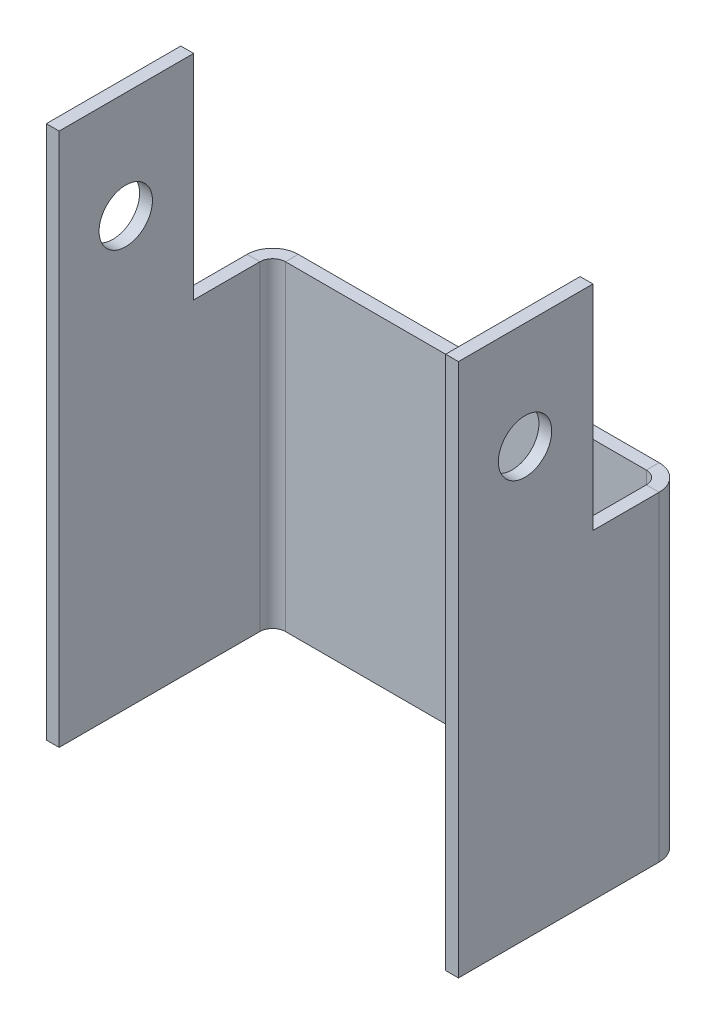
ISO-10303-21;
HEADER;
FILE_DESCRIPTION(('STEP AP214'),'2;1');
FILE_NAME('part.step','',(''),(''),'','','');
FILE_SCHEMA(('AUTOMOTIVE_DESIGN { 1 0 10303 214 1 1 1 1 }'));
ENDSEC;
DATA;
#1=APPLICATION_CONTEXT('core data for automotive mechanical design processes');
#2=APPLICATION_PROTOCOL_DEFINITION('international standard','automotive_design',2000,#1);
#3=PRODUCT_CONTEXT('',#1,'mechanical');
#4=PRODUCT('Part','Part','',(#3));
#5=PRODUCT_RELATED_PRODUCT_CATEGORY('part','',(#4));
#6=PRODUCT_DEFINITION_FORMATION('','',#4);
#7=PRODUCT_DEFINITION_CONTEXT('part definition',#1,'design');
#8=PRODUCT_DEFINITION('design','',#6,#7);
#9=PRODUCT_DEFINITION_SHAPE('','',#8);
#10=(LENGTH_UNIT() NAMED_UNIT(*) SI_UNIT(.MILLI.,.METRE.));
#11=(NAMED_UNIT(*) PLANE_ANGLE_UNIT() SI_UNIT($,.RADIAN.));
#12=(NAMED_UNIT(*) SI_UNIT($,.STERADIAN.) SOLID_ANGLE_UNIT());
#13=UNCERTAINTY_MEASURE_WITH_UNIT(LENGTH_MEASURE(1.E-05),#10,'distance_accuracy_value','');
#14=(GEOMETRIC_REPRESENTATION_CONTEXT(3) GLOBAL_UNCERTAINTY_ASSIGNED_CONTEXT((#13)) GLOBAL_UNIT_ASSIGNED_CONTEXT((#10,
#11,#12)) REPRESENTATION_CONTEXT('',''));
#15=CARTESIAN_POINT('',(0.,0.,0.));
#16=DIRECTION('',(0.,0.,1.));
#17=DIRECTION('',(1.,0.,0.));
#18=AXIS2_PLACEMENT_3D('',#15,#16,#17);
#19=CARTESIAN_POINT('',(-49.149,6.35000000000006,-1.52399999999975));
#20=DIRECTION('',(0.,-1.,0.));
#21=DIRECTION('',(1.,0.,0.));
#22=AXIS2_PLACEMENT_3D('',#19,#20,#21);
#23=PLANE('',#22);
#24=DIRECTION('',(0.,0.,-1.));
#25=VECTOR('',#24,1.);
#26=CARTESIAN_POINT('',(-22.987,6.35000000000006,0.));
#27=LINE('',#26,#25);
#28=CARTESIAN_POINT('',(-22.987,6.35000000000006,9.39800000000015));
#29=VERTEX_POINT('',#28);
#30=CARTESIAN_POINT('',(-22.987,6.35000000000006,1.52399999999999));
#31=VERTEX_POINT('',#30);
#32=EDGE_CURVE('E303',#29,#31,#27,.T.);
#33=ORIENTED_EDGE('',*,*,#32,.T.);
#34=DIRECTION('',(-1.,0.,0.));
#35=VECTOR('',#34,1.);
#36=CARTESIAN_POINT('',(-22.987,6.35000000000006,1.52399999999999));
#37=LINE('',#36,#35);
#38=CARTESIAN_POINT('',(-24.511,6.35000000000006,1.52399999999999));
#39=VERTEX_POINT('',#38);
#40=EDGE_CURVE('E13',#31,#39,#37,.T.);
#41=ORIENTED_EDGE('',*,*,#40,.T.);
#42=DIRECTION('',(0.,0.,-1.));
#43=VECTOR('',#42,1.);
#44=CARTESIAN_POINT('',(-24.511,6.35000000000006,0.));
#45=LINE('',#44,#43);
#46=CARTESIAN_POINT('',(-24.511,6.35000000000006,9.39800000000016));
#47=VERTEX_POINT('',#46);
#48=EDGE_CURVE('E436',#47,#39,#45,.T.);
#49=ORIENTED_EDGE('',*,*,#48,.F.);
#50=DIRECTION('',(1.,0.,0.));
#51=VECTOR('',#50,1.);
#52=CARTESIAN_POINT('',(-49.149,6.35000000000006,9.39800000000025));
#53=LINE('',#52,#51);
#54=EDGE_CURVE('E464',#47,#29,#53,.T.);
#55=ORIENTED_EDGE('',*,*,#54,.T.);
#56=EDGE_LOOP('',(#33,#41,#49,#55));
#57=FACE_BOUND('',#56,.T.);
#58=ADVANCED_FACE('F89',(#57),#23,.F.);
#59=DIRECTION('',(1.,0.,0.));
#60=VECTOR('',#59,1.);
#61=CARTESIAN_POINT('',(-49.149,6.35000000000006,-1.52399999999975));
#62=LINE('',#61,#60);
#63=CARTESIAN_POINT('',(-21.463,6.35000000000006,-1.52399999999985));
#64=VERTEX_POINT('',#63);
#65=CARTESIAN_POINT('',(21.463,6.35000000000006,-1.524));
#66=VERTEX_POINT('',#65);
#67=EDGE_CURVE('E300',#64,#66,#62,.T.);
#68=ORIENTED_EDGE('',*,*,#67,.F.);
#69=DIRECTION('',(0.,0.,1.));
#70=VECTOR('',#69,1.);
#71=CARTESIAN_POINT('',(-21.463,6.35000000000006,-1.52399999999985));
#72=LINE('',#71,#70);
#73=CARTESIAN_POINT('',(-21.463,6.35000000000006,0.));
#74=VERTEX_POINT('',#73);
#75=EDGE_CURVE('E98',#64,#74,#72,.T.);
#76=ORIENTED_EDGE('',*,*,#75,.T.);
#77=DIRECTION('',(1.,0.,0.));
#78=VECTOR('',#77,1.);
#79=CARTESIAN_POINT('',(0.,6.35000000000006,0.));
#80=LINE('',#79,#78);
#81=CARTESIAN_POINT('',(21.463,6.35000000000007,0.));
#82=VERTEX_POINT('',#81);
#83=EDGE_CURVE('E320',#74,#82,#80,.T.);
#84=ORIENTED_EDGE('',*,*,#83,.T.);
#85=DIRECTION('',(0.,0.,-1.));
#86=VECTOR('',#85,1.);
#87=CARTESIAN_POINT('',(21.463,6.35000000000007,0.));
#88=LINE('',#87,#86);
#89=EDGE_CURVE('E310',#82,#66,#88,.T.);
#90=ORIENTED_EDGE('',*,*,#89,.T.);
#91=EDGE_LOOP('',(#68,#76,#84,#90));
#92=FACE_BOUND('',#91,.T.);
#93=ADVANCED_FACE('F318',(#92),#23,.F.);
#94=ORIENTED_EDGE('',*,*,#40,.F.);
#95=CARTESIAN_POINT('',(-21.463,6.35000000000006,1.524));
#96=DIRECTION('',(0.,-1.,0.));
#97=DIRECTION('',(1.,0.,0.));
#98=AXIS2_PLACEMENT_3D('',#95,#96,#97);
#99=CIRCLE('',#98,1.524);
#100=EDGE_CURVE('E326',#74,#31,#99,.F.);
#101=ORIENTED_EDGE('',*,*,#100,.F.);
#102=ORIENTED_EDGE('',*,*,#75,.F.);
#103=CARTESIAN_POINT('',(-21.463,6.35000000000006,1.524));
#104=DIRECTION('',(0.,-1.,0.));
#105=DIRECTION('',(1.,0.,0.));
#106=AXIS2_PLACEMENT_3D('',#103,#104,#105);
#107=CIRCLE('',#106,3.048);
#108=EDGE_CURVE('E433',#64,#39,#107,.F.);
#109=ORIENTED_EDGE('',*,*,#108,.T.);
#110=EDGE_LOOP('',(#94,#101,#102,#109));
#111=FACE_BOUND('',#110,.T.);
#112=ADVANCED_FACE('F327',(#111),#23,.F.);
#113=DIRECTION('',(0.,0.,-1.));
#114=VECTOR('',#113,1.);
#115=CARTESIAN_POINT('',(24.511,6.35000000000007,-1.52400000000001));
#116=LINE('',#115,#114);
#117=CARTESIAN_POINT('',(24.511,6.35000000000007,9.39799999999999));
#118=VERTEX_POINT('',#117);
#119=CARTESIAN_POINT('',(24.511,6.35000000000007,1.52399999999999));
#120=VERTEX_POINT('',#119);
#121=EDGE_CURVE('E216',#118,#120,#116,.T.);
#122=ORIENTED_EDGE('',*,*,#121,.T.);
#123=DIRECTION('',(-1.,0.,0.));
#124=VECTOR('',#123,1.);
#125=CARTESIAN_POINT('',(24.511,6.35000000000007,1.52399999999999));
#126=LINE('',#125,#124);
#127=CARTESIAN_POINT('',(22.987,6.35000000000006,1.524));
#128=VERTEX_POINT('',#127);
#129=EDGE_CURVE('E307',#120,#128,#126,.T.);
#130=ORIENTED_EDGE('',*,*,#129,.T.);
#131=DIRECTION('',(0.,0.,-1.));
#132=VECTOR('',#131,1.);
#133=CARTESIAN_POINT('',(22.987,6.35000000000007,0.));
#134=LINE('',#133,#132);
#135=CARTESIAN_POINT('',(22.987,6.35000000000007,9.39799999999999));
#136=VERTEX_POINT('',#135);
#137=EDGE_CURVE('E440',#136,#128,#134,.T.);
#138=ORIENTED_EDGE('',*,*,#137,.F.);
#139=EDGE_CURVE('E461',#136,#118,#53,.T.);
#140=ORIENTED_EDGE('',*,*,#139,.T.);
#141=EDGE_LOOP('',(#122,#130,#138,#140));
#142=FACE_BOUND('',#141,.T.);
#143=ADVANCED_FACE('F470',(#142),#23,.F.);
#144=CARTESIAN_POINT('',(0.,0.,-1.524));
#145=DIRECTION('',(0.,0.,1.));
#146=DIRECTION('',(1.,0.,0.));
#147=AXIS2_PLACEMENT_3D('',#144,#145,#146);
#148=PLANE('',#147);
#149=DIRECTION('',(0.,-1.,0.));
#150=VECTOR('',#149,1.);
#151=CARTESIAN_POINT('',(-21.463,-31.75,-1.524));
#152=LINE('',#151,#150);
#153=CARTESIAN_POINT('',(-21.463,-31.75,-1.524));
#154=VERTEX_POINT('',#153);
#155=EDGE_CURVE('E352',#154,#64,#152,.F.);
#156=ORIENTED_EDGE('',*,*,#155,.T.);
#157=ORIENTED_EDGE('',*,*,#67,.T.);
#158=DIRECTION('',(0.,1.,0.));
#159=VECTOR('',#158,1.);
#160=CARTESIAN_POINT('',(21.463,31.75,-1.524));
#161=LINE('',#160,#159);
#162=CARTESIAN_POINT('',(21.463,-31.75,-1.524));
#163=VERTEX_POINT('',#162);
#164=EDGE_CURVE('E113',#66,#163,#161,.F.);
#165=ORIENTED_EDGE('',*,*,#164,.T.);
#166=DIRECTION('',(1.,0.,0.));
#167=VECTOR('',#166,1.);
#168=CARTESIAN_POINT('',(-24.511,-31.75,-1.524));
#169=LINE('',#168,#167);
#170=EDGE_CURVE('E288',#154,#163,#169,.T.);
#171=ORIENTED_EDGE('',*,*,#170,.F.);
#172=EDGE_LOOP('',(#156,#157,#165,#171));
#173=FACE_BOUND('',#172,.T.);
#174=ADVANCED_FACE('F387',(#173),#148,.F.);
#175=CARTESIAN_POINT('',(0.,0.,0.));
#176=DIRECTION('',(0.,0.,1.));
#177=DIRECTION('',(1.,0.,0.));
#178=AXIS2_PLACEMENT_3D('',#175,#176,#177);
#179=PLANE('',#178);
#180=ORIENTED_EDGE('',*,*,#83,.F.);
#181=DIRECTION('',(0.,-1.,0.));
#182=VECTOR('',#181,1.);
#183=CARTESIAN_POINT('',(-21.463,-31.75,0.));
#184=LINE('',#183,#182);
#185=CARTESIAN_POINT('',(-21.463,-31.75,0.));
#186=VERTEX_POINT('',#185);
#187=EDGE_CURVE('E336',#186,#74,#184,.F.);
#188=ORIENTED_EDGE('',*,*,#187,.F.);
#189=DIRECTION('',(1.,0.,0.));
#190=VECTOR('',#189,1.);
#191=CARTESIAN_POINT('',(-24.511,-31.75,0.));
#192=LINE('',#191,#190);
#193=CARTESIAN_POINT('',(21.463,-31.75,0.));
#194=VERTEX_POINT('',#193);
#195=EDGE_CURVE('E287',#186,#194,#192,.T.);
#196=ORIENTED_EDGE('',*,*,#195,.T.);
#197=DIRECTION('',(0.,1.,0.));
#198=VECTOR('',#197,1.);
#199=CARTESIAN_POINT('',(21.463,31.75,0.));
#200=LINE('',#199,#198);
#201=EDGE_CURVE('E281',#82,#194,#200,.F.);
#202=ORIENTED_EDGE('',*,*,#201,.F.);
#203=EDGE_LOOP('',(#180,#188,#196,#202));
#204=FACE_BOUND('',#203,.T.);
#205=ADVANCED_FACE('F335',(#204),#179,.T.);
#206=CARTESIAN_POINT('',(-24.511,-31.75,-1.524));
#207=DIRECTION('',(0.,-1.,0.));
#208=DIRECTION('',(0.,0.,-1.));
#209=AXIS2_PLACEMENT_3D('',#206,#207,#208);
#210=PLANE('',#209);
#211=ORIENTED_EDGE('',*,*,#195,.F.);
#212=DIRECTION('',(0.,0.,-1.));
#213=VECTOR('',#212,1.);
#214=CARTESIAN_POINT('',(-21.463,-31.75,0.));
#215=LINE('',#214,#213);
#216=EDGE_CURVE('E269',#186,#154,#215,.T.);
#217=ORIENTED_EDGE('',*,*,#216,.T.);
#218=ORIENTED_EDGE('',*,*,#170,.T.);
#219=DIRECTION('',(0.,0.,-1.));
#220=VECTOR('',#219,1.);
#221=CARTESIAN_POINT('',(21.463,-31.75,0.));
#222=LINE('',#221,#220);
#223=EDGE_CURVE('E277',#194,#163,#222,.T.);
#224=ORIENTED_EDGE('',*,*,#223,.F.);
#225=EDGE_LOOP('',(#211,#217,#218,#224));
#226=FACE_BOUND('',#225,.T.);
#227=ADVANCED_FACE('F91',(#226),#210,.T.);
#228=CARTESIAN_POINT('',(21.463,-31.75,1.524));
#229=DIRECTION('',(0.,-1.,0.));
#230=DIRECTION('',(0.,0.,-1.));
#231=AXIS2_PLACEMENT_3D('',#228,#229,#230);
#232=PLANE('',#231);
#233=DIRECTION('',(1.,0.,0.));
#234=VECTOR('',#233,1.);
#235=CARTESIAN_POINT('',(24.511,-31.75,1.52399999999999));
#236=LINE('',#235,#234);
#237=CARTESIAN_POINT('',(22.987,-31.75,1.524));
#238=VERTEX_POINT('',#237);
#239=CARTESIAN_POINT('',(24.511,-31.7499999999999,1.52399999999999));
#240=VERTEX_POINT('',#239);
#241=EDGE_CURVE('E265',#238,#240,#236,.T.);
#242=ORIENTED_EDGE('',*,*,#241,.F.);
#243=CARTESIAN_POINT('',(21.463,-31.75,1.524));
#244=DIRECTION('',(0.,1.,0.));
#245=DIRECTION('',(0.,0.,1.));
#246=AXIS2_PLACEMENT_3D('',#243,#244,#245);
#247=CIRCLE('',#246,1.524);
#248=EDGE_CURVE('E273',#194,#238,#247,.F.);
#249=ORIENTED_EDGE('',*,*,#248,.F.);
#250=ORIENTED_EDGE('',*,*,#223,.T.);
#251=CARTESIAN_POINT('',(21.463,-31.7499999999999,1.524));
#252=DIRECTION('',(0.,1.,0.));
#253=DIRECTION('',(0.,0.,1.));
#254=AXIS2_PLACEMENT_3D('',#251,#252,#253);
#255=CIRCLE('',#254,3.048);
#256=EDGE_CURVE('E272',#163,#240,#255,.F.);
#257=ORIENTED_EDGE('',*,*,#256,.T.);
#258=EDGE_LOOP('',(#242,#249,#250,#257));
#259=FACE_BOUND('',#258,.T.);
#260=ADVANCED_FACE('F380',(#259),#232,.T.);
#261=CARTESIAN_POINT('',(21.463,31.75,1.52400000000001));
#262=DIRECTION('',(0.,1.,0.));
#263=DIRECTION('',(1.,0.,0.));
#264=AXIS2_PLACEMENT_3D('',#261,#262,#263);
#265=CYLINDRICAL_SURFACE('',#264,3.048);
#266=CARTESIAN_POINT('',(21.463,6.35000000000006,1.524));
#267=DIRECTION('',(0.,-1.,0.));
#268=DIRECTION('',(1.,0.,0.));
#269=AXIS2_PLACEMENT_3D('',#266,#267,#268);
#270=CIRCLE('',#269,3.048);
#271=EDGE_CURVE('E378',#120,#66,#270,.F.);
#272=ORIENTED_EDGE('',*,*,#271,.F.);
#273=DIRECTION('',(0.,1.,0.));
#274=VECTOR('',#273,1.);
#275=CARTESIAN_POINT('',(24.511,0.,1.52399999999999));
#276=LINE('',#275,#274);
#277=EDGE_CURVE('E258',#240,#120,#276,.T.);
#278=ORIENTED_EDGE('',*,*,#277,.F.);
#279=ORIENTED_EDGE('',*,*,#256,.F.);
#280=ORIENTED_EDGE('',*,*,#164,.F.);
#281=EDGE_LOOP('',(#272,#278,#279,#280));
#282=FACE_BOUND('',#281,.T.);
#283=ADVANCED_FACE('F376',(#282),#265,.T.);
#284=CARTESIAN_POINT('',(21.463,31.75,1.52400000000001));
#285=DIRECTION('',(0.,1.,0.));
#286=DIRECTION('',(1.,0.,0.));
#287=AXIS2_PLACEMENT_3D('',#284,#285,#286);
#288=CYLINDRICAL_SURFACE('',#287,1.524);
#289=DIRECTION('',(0.,-1.,0.));
#290=VECTOR('',#289,1.);
#291=CARTESIAN_POINT('',(22.987,-31.75,1.52399999999999));
#292=LINE('',#291,#290);
#293=EDGE_CURVE('E261',#238,#128,#292,.F.);
#294=ORIENTED_EDGE('',*,*,#293,.T.);
#295=CARTESIAN_POINT('',(21.463,6.35000000000006,1.524));
#296=DIRECTION('',(0.,-1.,0.));
#297=DIRECTION('',(1.,0.,0.));
#298=AXIS2_PLACEMENT_3D('',#295,#296,#297);
#299=CIRCLE('',#298,1.524);
#300=EDGE_CURVE('E339',#128,#82,#299,.F.);
#301=ORIENTED_EDGE('',*,*,#300,.T.);
#302=ORIENTED_EDGE('',*,*,#201,.T.);
#303=ORIENTED_EDGE('',*,*,#248,.T.);
#304=EDGE_LOOP('',(#294,#301,#302,#303));
#305=FACE_BOUND('',#304,.T.);
#306=ADVANCED_FACE('F473',(#305),#288,.F.);
#307=CARTESIAN_POINT('',(24.511,31.75,0.));
#308=DIRECTION('',(0.,1.,0.));
#309=DIRECTION('',(-1.,0.,0.));
#310=AXIS2_PLACEMENT_3D('',#307,#308,#309);
#311=PLANE('',#310);
#312=DIRECTION('',(1.,0.,0.));
#313=VECTOR('',#312,1.);
#314=CARTESIAN_POINT('',(-49.149,31.75,9.39800000000025));
#315=LINE('',#314,#313);
#316=CARTESIAN_POINT('',(22.987,31.75,9.39799999999999));
#317=VERTEX_POINT('',#316);
#318=CARTESIAN_POINT('',(24.511,31.75,9.39799999999999));
#319=VERTEX_POINT('',#318);
#320=EDGE_CURVE('E203',#317,#319,#315,.T.);
#321=ORIENTED_EDGE('',*,*,#320,.F.);
#322=DIRECTION('',(0.,0.,1.));
#323=VECTOR('',#322,1.);
#324=CARTESIAN_POINT('',(22.987,31.75,0.));
#325=LINE('',#324,#323);
#326=CARTESIAN_POINT('',(22.9870000000001,31.75,25.4));
#327=VERTEX_POINT('',#326);
#328=EDGE_CURVE('E248',#327,#317,#325,.F.);
#329=ORIENTED_EDGE('',*,*,#328,.F.);
#330=DIRECTION('',(-1.,0.,0.));
#331=VECTOR('',#330,1.);
#332=CARTESIAN_POINT('',(24.5110000000001,31.75,25.4));
#333=LINE('',#332,#331);
#334=CARTESIAN_POINT('',(24.5110000000001,31.75,25.4));
#335=VERTEX_POINT('',#334);
#336=EDGE_CURVE('E230',#335,#327,#333,.T.);
#337=ORIENTED_EDGE('',*,*,#336,.F.);
#338=DIRECTION('',(0.,0.,-1.));
#339=VECTOR('',#338,1.);
#340=CARTESIAN_POINT('',(24.511,31.75,0.));
#341=LINE('',#340,#339);
#342=EDGE_CURVE('E223',#335,#319,#341,.T.);
#343=ORIENTED_EDGE('',*,*,#342,.T.);
#344=EDGE_LOOP('',(#321,#329,#337,#343));
#345=FACE_BOUND('',#344,.T.);
#346=ADVANCED_FACE('F229',(#345),#311,.T.);
#347=CARTESIAN_POINT('',(24.5110000000001,-31.75,25.4));
#348=DIRECTION('',(0.,-1.,0.));
#349=DIRECTION('',(1.,0.,0.));
#350=AXIS2_PLACEMENT_3D('',#347,#348,#349);
#351=PLANE('',#350);
#352=DIRECTION('',(0.,0.,-1.));
#353=VECTOR('',#352,1.);
#354=CARTESIAN_POINT('',(22.987,-31.75,0.));
#355=LINE('',#354,#353);
#356=CARTESIAN_POINT('',(22.9870000000001,-31.75,25.4));
#357=VERTEX_POINT('',#356);
#358=EDGE_CURVE('E255',#238,#357,#355,.F.);
#359=ORIENTED_EDGE('',*,*,#358,.F.);
#360=ORIENTED_EDGE('',*,*,#241,.T.);
#361=DIRECTION('',(0.,0.,1.));
#362=VECTOR('',#361,1.);
#363=CARTESIAN_POINT('',(24.5110000000001,-31.75,25.4));
#364=LINE('',#363,#362);
#365=CARTESIAN_POINT('',(24.5110000000001,-31.75,25.4));
#366=VERTEX_POINT('',#365);
#367=EDGE_CURVE('E242',#240,#366,#364,.T.);
#368=ORIENTED_EDGE('',*,*,#367,.T.);
#369=DIRECTION('',(-1.,0.,0.));
#370=VECTOR('',#369,1.);
#371=CARTESIAN_POINT('',(24.5110000000001,-31.75,25.4));
#372=LINE('',#371,#370);
#373=EDGE_CURVE('E233',#366,#357,#372,.T.);
#374=ORIENTED_EDGE('',*,*,#373,.T.);
#375=EDGE_LOOP('',(#359,#360,#368,#374));
#376=FACE_BOUND('',#375,.T.);
#377=ADVANCED_FACE('F371',(#376),#351,.T.);
#378=CARTESIAN_POINT('',(24.511,0.,0.));
#379=DIRECTION('',(1.,0.,0.));
#380=DIRECTION('',(0.,0.,-1.));
#381=AXIS2_PLACEMENT_3D('',#378,#379,#380);
#382=PLANE('',#381);
#383=ORIENTED_EDGE('',*,*,#121,.F.);
#384=DIRECTION('',(0.,-1.,0.));
#385=VECTOR('',#384,1.);
#386=CARTESIAN_POINT('',(24.511,31.75,9.39799999999999));
#387=LINE('',#386,#385);
#388=EDGE_CURVE('E207',#319,#118,#387,.T.);
#389=ORIENTED_EDGE('',*,*,#388,.F.);
#390=ORIENTED_EDGE('',*,*,#342,.F.);
#391=DIRECTION('',(0.,1.,0.));
#392=VECTOR('',#391,1.);
#393=CARTESIAN_POINT('',(24.5110000000001,31.75,25.4));
#394=LINE('',#393,#392);
#395=EDGE_CURVE('E234',#366,#335,#394,.T.);
#396=ORIENTED_EDGE('',*,*,#395,.F.);
#397=ORIENTED_EDGE('',*,*,#367,.F.);
#398=ORIENTED_EDGE('',*,*,#277,.T.);
#399=EDGE_LOOP('',(#383,#389,#390,#396,#397,#398));
#400=FACE_BOUND('',#399,.T.);
#401=CARTESIAN_POINT('',(24.5110000000001,19.0500000000001,17.4752));
#402=DIRECTION('',(1.,0.,0.));
#403=DIRECTION('',(0.,0.,-1.));
#404=AXIS2_PLACEMENT_3D('',#401,#402,#403);
#405=CIRCLE('',#404,3.175);
#406=CARTESIAN_POINT('',(24.511,19.0500000000001,14.3002));
#407=VERTEX_POINT('',#406);
#408=EDGE_CURVE('E227',#407,#407,#405,.T.);
#409=ORIENTED_EDGE('',*,*,#408,.F.);
#410=EDGE_LOOP('',(#409));
#411=FACE_BOUND('',#410,.T.);
#412=ADVANCED_FACE('F220',(#400,#411),#382,.T.);
#413=CARTESIAN_POINT('',(22.987,0.,0.));
#414=DIRECTION('',(1.,0.,0.));
#415=DIRECTION('',(0.,0.,-1.));
#416=AXIS2_PLACEMENT_3D('',#413,#414,#415);
#417=PLANE('',#416);
#418=CARTESIAN_POINT('',(22.9870000000001,19.0500000000001,17.4752));
#419=DIRECTION('',(1.,0.,0.));
#420=DIRECTION('',(0.,0.,-1.));
#421=AXIS2_PLACEMENT_3D('',#418,#419,#420);
#422=CIRCLE('',#421,3.175);
#423=CARTESIAN_POINT('',(22.987,19.0500000000001,14.3002));
#424=VERTEX_POINT('',#423);
#425=EDGE_CURVE('E451',#424,#424,#422,.T.);
#426=ORIENTED_EDGE('',*,*,#425,.T.);
#427=EDGE_LOOP('',(#426));
#428=FACE_BOUND('',#427,.T.);
#429=DIRECTION('',(0.,-1.,0.));
#430=VECTOR('',#429,1.);
#431=CARTESIAN_POINT('',(22.987,0.,9.39799999999999));
#432=LINE('',#431,#430);
#433=EDGE_CURVE('E210',#317,#136,#432,.T.);
#434=ORIENTED_EDGE('',*,*,#433,.T.);
#435=ORIENTED_EDGE('',*,*,#137,.T.);
#436=ORIENTED_EDGE('',*,*,#293,.F.);
#437=ORIENTED_EDGE('',*,*,#358,.T.);
#438=DIRECTION('',(0.,-1.,0.));
#439=VECTOR('',#438,1.);
#440=CARTESIAN_POINT('',(22.9870000000001,0.,25.4));
#441=LINE('',#440,#439);
#442=EDGE_CURVE('E251',#357,#327,#441,.F.);
#443=ORIENTED_EDGE('',*,*,#442,.T.);
#444=ORIENTED_EDGE('',*,*,#328,.T.);
#445=EDGE_LOOP('',(#434,#435,#436,#437,#443,#444));
#446=FACE_BOUND('',#445,.T.);
#447=ADVANCED_FACE('F366',(#428,#446),#417,.F.);
#448=CARTESIAN_POINT('',(24.5110000000001,31.75,25.4));
#449=DIRECTION('',(0.,0.,1.));
#450=DIRECTION('',(1.,0.,0.));
#451=AXIS2_PLACEMENT_3D('',#448,#449,#450);
#452=PLANE('',#451);
#453=ORIENTED_EDGE('',*,*,#442,.F.);
#454=ORIENTED_EDGE('',*,*,#373,.F.);
#455=ORIENTED_EDGE('',*,*,#395,.T.);
#456=ORIENTED_EDGE('',*,*,#336,.T.);
#457=EDGE_LOOP('',(#453,#454,#455,#456));
#458=FACE_BOUND('',#457,.T.);
#459=ADVANCED_FACE('F363',(#458),#452,.T.);
#460=CARTESIAN_POINT('',(-21.463,-31.75,1.524));
#461=DIRECTION('',(0.,1.,0.));
#462=DIRECTION('',(0.,0.,1.));
#463=AXIS2_PLACEMENT_3D('',#460,#461,#462);
#464=PLANE('',#463);
#465=CARTESIAN_POINT('',(-21.463,-31.75,1.524));
#466=DIRECTION('',(0.,-1.,0.));
#467=DIRECTION('',(0.,0.,-1.));
#468=AXIS2_PLACEMENT_3D('',#465,#466,#467);
#469=CIRCLE('',#468,1.524);
#470=CARTESIAN_POINT('',(-22.987,-31.75,1.52399999999999));
#471=VERTEX_POINT('',#470);
#472=EDGE_CURVE('E344',#471,#186,#469,.T.);
#473=ORIENTED_EDGE('',*,*,#472,.F.);
#474=DIRECTION('',(-1.,0.,0.));
#475=VECTOR('',#474,1.);
#476=CARTESIAN_POINT('',(-22.987,-31.75,1.52399999999999));
#477=LINE('',#476,#475);
#478=CARTESIAN_POINT('',(-24.511,-31.75,1.52399999999999));
#479=VERTEX_POINT('',#478);
#480=EDGE_CURVE('E395',#471,#479,#477,.T.);
#481=ORIENTED_EDGE('',*,*,#480,.T.);
#482=CARTESIAN_POINT('',(-21.463,-31.75,1.524));
#483=DIRECTION('',(0.,-1.,0.));
#484=DIRECTION('',(0.,0.,-1.));
#485=AXIS2_PLACEMENT_3D('',#482,#483,#484);
#486=CIRCLE('',#485,3.048);
#487=EDGE_CURVE('E346',#479,#154,#486,.T.);
#488=ORIENTED_EDGE('',*,*,#487,.T.);
#489=ORIENTED_EDGE('',*,*,#216,.F.);
#490=EDGE_LOOP('',(#473,#481,#488,#489));
#491=FACE_BOUND('',#490,.T.);
#492=ADVANCED_FACE('F534',(#491),#464,.F.);
#493=CARTESIAN_POINT('',(-21.463,-31.75,1.524));
#494=DIRECTION('',(0.,-1.,0.));
#495=DIRECTION('',(-1.,0.,0.));
#496=AXIS2_PLACEMENT_3D('',#493,#494,#495);
#497=CYLINDRICAL_SURFACE('',#496,3.048);
#498=ORIENTED_EDGE('',*,*,#108,.F.);
#499=ORIENTED_EDGE('',*,*,#155,.F.);
#500=ORIENTED_EDGE('',*,*,#487,.F.);
#501=DIRECTION('',(0.,-1.,0.));
#502=VECTOR('',#501,1.);
#503=CARTESIAN_POINT('',(-24.511,31.75,1.52399999999999));
#504=LINE('',#503,#502);
#505=EDGE_CURVE('E399',#479,#39,#504,.F.);
#506=ORIENTED_EDGE('',*,*,#505,.T.);
#507=EDGE_LOOP('',(#498,#499,#500,#506));
#508=FACE_BOUND('',#507,.T.);
#509=ADVANCED_FACE('F538',(#508),#497,.T.);
#510=CARTESIAN_POINT('',(-21.463,-31.75,1.524));
#511=DIRECTION('',(0.,-1.,0.));
#512=DIRECTION('',(-1.,0.,0.));
#513=AXIS2_PLACEMENT_3D('',#510,#511,#512);
#514=CYLINDRICAL_SURFACE('',#513,1.524);
#515=ORIENTED_EDGE('',*,*,#187,.T.);
#516=ORIENTED_EDGE('',*,*,#100,.T.);
#517=DIRECTION('',(0.,-1.,0.));
#518=VECTOR('',#517,1.);
#519=CARTESIAN_POINT('',(-22.987,31.75,1.52399999999999));
#520=LINE('',#519,#518);
#521=EDGE_CURVE('E392',#31,#471,#520,.T.);
#522=ORIENTED_EDGE('',*,*,#521,.T.);
#523=ORIENTED_EDGE('',*,*,#472,.T.);
#524=EDGE_LOOP('',(#515,#516,#522,#523));
#525=FACE_BOUND('',#524,.T.);
#526=ADVANCED_FACE('F342',(#525),#514,.F.);
#527=CARTESIAN_POINT('',(-24.511,31.75,0.));
#528=DIRECTION('',(0.,1.,0.));
#529=DIRECTION('',(-1.,0.,0.));
#530=AXIS2_PLACEMENT_3D('',#527,#528,#529);
#531=PLANE('',#530);
#532=CARTESIAN_POINT('',(-24.511,31.75,9.39800000000016));
#533=VERTEX_POINT('',#532);
#534=CARTESIAN_POINT('',(-22.987,31.75,9.39800000000016));
#535=VERTEX_POINT('',#534);
#536=EDGE_CURVE('E105',#533,#535,#315,.T.);
#537=ORIENTED_EDGE('',*,*,#536,.F.);
#538=DIRECTION('',(0.,0.,-1.));
#539=VECTOR('',#538,1.);
#540=CARTESIAN_POINT('',(-24.511,31.75,0.));
#541=LINE('',#540,#539);
#542=CARTESIAN_POINT('',(-24.5110000000001,31.75,25.4));
#543=VERTEX_POINT('',#542);
#544=EDGE_CURVE('E414',#533,#543,#541,.F.);
#545=ORIENTED_EDGE('',*,*,#544,.T.);
#546=DIRECTION('',(1.,0.,0.));
#547=VECTOR('',#546,1.);
#548=CARTESIAN_POINT('',(-24.5110000000001,31.75,25.4));
#549=LINE('',#548,#547);
#550=CARTESIAN_POINT('',(-22.9870000000001,31.75,25.4));
#551=VERTEX_POINT('',#550);
#552=EDGE_CURVE('E425',#543,#551,#549,.T.);
#553=ORIENTED_EDGE('',*,*,#552,.T.);
#554=DIRECTION('',(0.,0.,1.));
#555=VECTOR('',#554,1.);
#556=CARTESIAN_POINT('',(-22.987,31.75,0.));
#557=LINE('',#556,#555);
#558=EDGE_CURVE('E403',#535,#551,#557,.T.);
#559=ORIENTED_EDGE('',*,*,#558,.F.);
#560=EDGE_LOOP('',(#537,#545,#553,#559));
#561=FACE_BOUND('',#560,.T.);
#562=ADVANCED_FACE('F526',(#561),#531,.T.);
#563=CARTESIAN_POINT('',(-24.5110000000001,-31.75,25.4));
#564=DIRECTION('',(0.,-1.,0.));
#565=DIRECTION('',(1.,0.,0.));
#566=AXIS2_PLACEMENT_3D('',#563,#564,#565);
#567=PLANE('',#566);
#568=DIRECTION('',(0.,0.,1.));
#569=VECTOR('',#568,1.);
#570=CARTESIAN_POINT('',(-24.5110000000001,-31.75,25.4));
#571=LINE('',#570,#569);
#572=CARTESIAN_POINT('',(-24.5110000000001,-31.75,25.4));
#573=VERTEX_POINT('',#572);
#574=EDGE_CURVE('E421',#573,#479,#571,.F.);
#575=ORIENTED_EDGE('',*,*,#574,.T.);
#576=ORIENTED_EDGE('',*,*,#480,.F.);
#577=DIRECTION('',(0.,0.,-1.));
#578=VECTOR('',#577,1.);
#579=CARTESIAN_POINT('',(-22.987,-31.75,0.));
#580=LINE('',#579,#578);
#581=CARTESIAN_POINT('',(-22.9870000000001,-31.75,25.4));
#582=VERTEX_POINT('',#581);
#583=EDGE_CURVE('E410',#582,#471,#580,.T.);
#584=ORIENTED_EDGE('',*,*,#583,.F.);
#585=DIRECTION('',(1.,0.,0.));
#586=VECTOR('',#585,1.);
#587=CARTESIAN_POINT('',(-24.5110000000001,-31.75,25.4));
#588=LINE('',#587,#586);
#589=EDGE_CURVE('E354',#573,#582,#588,.T.);
#590=ORIENTED_EDGE('',*,*,#589,.F.);
#591=EDGE_LOOP('',(#575,#576,#584,#590));
#592=FACE_BOUND('',#591,.T.);
#593=ADVANCED_FACE('F521',(#592),#567,.T.);
#594=CARTESIAN_POINT('',(-24.511,0.,0.));
#595=DIRECTION('',(1.,0.,0.));
#596=DIRECTION('',(0.,0.,-1.));
#597=AXIS2_PLACEMENT_3D('',#594,#595,#596);
#598=PLANE('',#597);
#599=CARTESIAN_POINT('',(-24.5110000000001,19.0500000000001,17.4752000000002));
#600=DIRECTION('',(1.,0.,0.));
#601=DIRECTION('',(0.,0.,-1.));
#602=AXIS2_PLACEMENT_3D('',#599,#600,#601);
#603=CIRCLE('',#602,3.175);
#604=CARTESIAN_POINT('',(-24.5110000000001,19.0500000000001,14.3002000000002));
#605=VERTEX_POINT('',#604);
#606=EDGE_CURVE('E299',#605,#605,#603,.T.);
#607=ORIENTED_EDGE('',*,*,#606,.T.);
#608=EDGE_LOOP('',(#607));
#609=FACE_BOUND('',#608,.T.);
#610=DIRECTION('',(0.,-1.,0.));
#611=VECTOR('',#610,1.);
#612=CARTESIAN_POINT('',(-24.511,0.,9.39800000000016));
#613=LINE('',#612,#611);
#614=EDGE_CURVE('E447',#533,#47,#613,.T.);
#615=ORIENTED_EDGE('',*,*,#614,.T.);
#616=ORIENTED_EDGE('',*,*,#48,.T.);
#617=ORIENTED_EDGE('',*,*,#505,.F.);
#618=ORIENTED_EDGE('',*,*,#574,.F.);
#619=DIRECTION('',(0.,1.,0.));
#620=VECTOR('',#619,1.);
#621=CARTESIAN_POINT('',(-24.5110000000001,31.75,25.4));
#622=LINE('',#621,#620);
#623=EDGE_CURVE('E417',#543,#573,#622,.F.);
#624=ORIENTED_EDGE('',*,*,#623,.F.);
#625=ORIENTED_EDGE('',*,*,#544,.F.);
#626=EDGE_LOOP('',(#615,#616,#617,#618,#624,#625));
#627=FACE_BOUND('',#626,.T.);
#628=ADVANCED_FACE('F525',(#609,#627),#598,.F.);
#629=CARTESIAN_POINT('',(-22.987,0.,0.));
#630=DIRECTION('',(1.,0.,0.));
#631=DIRECTION('',(0.,0.,-1.));
#632=AXIS2_PLACEMENT_3D('',#629,#630,#631);
#633=PLANE('',#632);
#634=ORIENTED_EDGE('',*,*,#32,.F.);
#635=DIRECTION('',(0.,-1.,0.));
#636=VECTOR('',#635,1.);
#637=CARTESIAN_POINT('',(-22.987,0.,9.39800000000015));
#638=LINE('',#637,#636);
#639=EDGE_CURVE('E291',#535,#29,#638,.T.);
#640=ORIENTED_EDGE('',*,*,#639,.F.);
#641=ORIENTED_EDGE('',*,*,#558,.T.);
#642=DIRECTION('',(0.,-1.,0.));
#643=VECTOR('',#642,1.);
#644=CARTESIAN_POINT('',(-22.9870000000001,0.,25.4));
#645=LINE('',#644,#643);
#646=EDGE_CURVE('E406',#551,#582,#645,.T.);
#647=ORIENTED_EDGE('',*,*,#646,.T.);
#648=ORIENTED_EDGE('',*,*,#583,.T.);
#649=ORIENTED_EDGE('',*,*,#521,.F.);
#650=EDGE_LOOP('',(#634,#640,#641,#647,#648,#649));
#651=FACE_BOUND('',#650,.T.);
#652=CARTESIAN_POINT('',(-22.9870000000001,19.0500000000001,17.4752000000002));
#653=DIRECTION('',(1.,0.,0.));
#654=DIRECTION('',(0.,0.,-1.));
#655=AXIS2_PLACEMENT_3D('',#652,#653,#654);
#656=CIRCLE('',#655,3.175);
#657=CARTESIAN_POINT('',(-22.9870000000001,19.0500000000001,14.3002000000002));
#658=VERTEX_POINT('',#657);
#659=EDGE_CURVE('E295',#658,#658,#656,.T.);
#660=ORIENTED_EDGE('',*,*,#659,.F.);
#661=EDGE_LOOP('',(#660));
#662=FACE_BOUND('',#661,.T.);
#663=ADVANCED_FACE('F514',(#651,#662),#633,.T.);
#664=CARTESIAN_POINT('',(-24.5110000000001,31.75,25.4));
#665=DIRECTION('',(0.,0.,1.));
#666=DIRECTION('',(1.,0.,0.));
#667=AXIS2_PLACEMENT_3D('',#664,#665,#666);
#668=PLANE('',#667);
#669=ORIENTED_EDGE('',*,*,#646,.F.);
#670=ORIENTED_EDGE('',*,*,#552,.F.);
#671=ORIENTED_EDGE('',*,*,#623,.T.);
#672=ORIENTED_EDGE('',*,*,#589,.T.);
#673=EDGE_LOOP('',(#669,#670,#671,#672));
#674=FACE_BOUND('',#673,.T.);
#675=ADVANCED_FACE('F485',(#674),#668,.T.);
#676=CARTESIAN_POINT('',(-49.149,19.0500000000001,17.4752000000003));
#677=DIRECTION('',(1.,0.,0.));
#678=DIRECTION('',(0.,0.,-1.));
#679=AXIS2_PLACEMENT_3D('',#676,#677,#678);
#680=CYLINDRICAL_SURFACE('',#679,3.175);
#681=ORIENTED_EDGE('',*,*,#659,.T.);
#682=EDGE_LOOP('',(#681));
#683=FACE_BOUND('',#682,.T.);
#684=ORIENTED_EDGE('',*,*,#606,.F.);
#685=EDGE_LOOP('',(#684));
#686=FACE_BOUND('',#685,.T.);
#687=ADVANCED_FACE('F477',(#683,#686),#680,.F.);
#688=ORIENTED_EDGE('',*,*,#89,.F.);
#689=ORIENTED_EDGE('',*,*,#300,.F.);
#690=ORIENTED_EDGE('',*,*,#129,.F.);
#691=ORIENTED_EDGE('',*,*,#271,.T.);
#692=EDGE_LOOP('',(#688,#689,#690,#691));
#693=FACE_BOUND('',#692,.T.);
#694=ADVANCED_FACE('F475',(#693),#23,.F.);
#695=CARTESIAN_POINT('',(-49.149,31.75,9.39800000000025));
#696=DIRECTION('',(0.,0.,1.));
#697=DIRECTION('',(1.,0.,0.));
#698=AXIS2_PLACEMENT_3D('',#695,#696,#697);
#699=PLANE('',#698);
#700=ORIENTED_EDGE('',*,*,#320,.T.);
#701=ORIENTED_EDGE('',*,*,#388,.T.);
#702=ORIENTED_EDGE('',*,*,#139,.F.);
#703=ORIENTED_EDGE('',*,*,#433,.F.);
#704=EDGE_LOOP('',(#700,#701,#702,#703));
#705=FACE_BOUND('',#704,.T.);
#706=ADVANCED_FACE('F205',(#705),#699,.F.);
#707=ORIENTED_EDGE('',*,*,#536,.T.);
#708=ORIENTED_EDGE('',*,*,#639,.T.);
#709=ORIENTED_EDGE('',*,*,#54,.F.);
#710=ORIENTED_EDGE('',*,*,#614,.F.);
#711=EDGE_LOOP('',(#707,#708,#709,#710));
#712=FACE_BOUND('',#711,.T.);
#713=ADVANCED_FACE('F483',(#712),#699,.F.);
#714=ORIENTED_EDGE('',*,*,#408,.T.);
#715=EDGE_LOOP('',(#714));
#716=FACE_BOUND('',#715,.T.);
#717=ORIENTED_EDGE('',*,*,#425,.F.);
#718=EDGE_LOOP('',(#717));
#719=FACE_BOUND('',#718,.T.);
#720=ADVANCED_FACE('F488',(#716,#719),#680,.F.);
#721=CLOSED_SHELL('',(#58,#93,#112,#143,#174,#205,#227,#260,#283,#306,#346,#377,#412,#447,#459,
#492,#509,#526,#562,#593,#628,#663,#675,#687,#694,#706,#713,#720));
#722=MANIFOLD_SOLID_BREP('B2',#721);
#723=ADVANCED_BREP_SHAPE_REPRESENTATION('',(#18,#722),#14);
#724=SHAPE_DEFINITION_REPRESENTATION(#9,#723);
ENDSEC;
END-ISO-10303-21;
